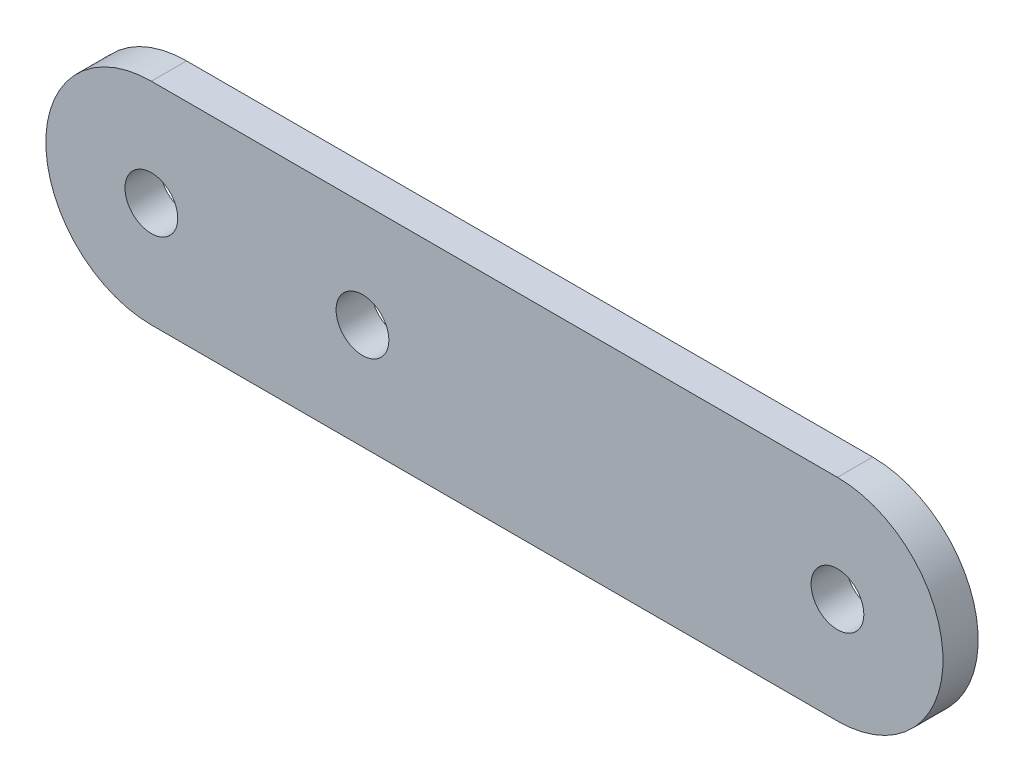
ISO-10303-21;
HEADER;
FILE_DESCRIPTION(('STEP AP214'),'2;1');
FILE_NAME('part.step','',(''),(''),'','','');
FILE_SCHEMA(('AUTOMOTIVE_DESIGN { 1 0 10303 214 1 1 1 1 }'));
ENDSEC;
DATA;
#1=APPLICATION_CONTEXT('core data for automotive mechanical design processes');
#2=APPLICATION_PROTOCOL_DEFINITION('international standard','automotive_design',2000,#1);
#3=PRODUCT_CONTEXT('',#1,'mechanical');
#4=PRODUCT('Part','Part','',(#3));
#5=PRODUCT_RELATED_PRODUCT_CATEGORY('part','',(#4));
#6=PRODUCT_DEFINITION_FORMATION('','',#4);
#7=PRODUCT_DEFINITION_CONTEXT('part definition',#1,'design');
#8=PRODUCT_DEFINITION('design','',#6,#7);
#9=PRODUCT_DEFINITION_SHAPE('','',#8);
#10=(LENGTH_UNIT() NAMED_UNIT(*) SI_UNIT(.MILLI.,.METRE.));
#11=(NAMED_UNIT(*) PLANE_ANGLE_UNIT() SI_UNIT($,.RADIAN.));
#12=(NAMED_UNIT(*) SI_UNIT($,.STERADIAN.) SOLID_ANGLE_UNIT());
#13=UNCERTAINTY_MEASURE_WITH_UNIT(LENGTH_MEASURE(1.E-05),#10,'distance_accuracy_value','');
#14=(GEOMETRIC_REPRESENTATION_CONTEXT(3) GLOBAL_UNCERTAINTY_ASSIGNED_CONTEXT((#13)) GLOBAL_UNIT_ASSIGNED_CONTEXT((#10,
#11,#12)) REPRESENTATION_CONTEXT('',''));
#15=CARTESIAN_POINT('',(0.,0.,0.));
#16=DIRECTION('',(0.,0.,1.));
#17=DIRECTION('',(1.,0.,0.));
#18=AXIS2_PLACEMENT_3D('',#15,#16,#17);
#19=CARTESIAN_POINT('',(0.,0.,2.));
#20=DIRECTION('',(0.,0.,-1.));
#21=DIRECTION('',(-1.,0.,0.));
#22=AXIS2_PLACEMENT_3D('',#19,#20,#21);
#23=PLANE('',#22);
#24=CARTESIAN_POINT('',(0.,0.,2.));
#25=DIRECTION('',(0.,0.,1.));
#26=DIRECTION('',(-1.,0.,0.));
#27=AXIS2_PLACEMENT_3D('',#24,#25,#26);
#28=CIRCLE('',#27,6.);
#29=CARTESIAN_POINT('',(0.,6.,2.));
#30=VERTEX_POINT('',#29);
#31=CARTESIAN_POINT('',(0.,-6.,2.));
#32=VERTEX_POINT('',#31);
#33=EDGE_CURVE('E85',#30,#32,#28,.T.);
#34=ORIENTED_EDGE('',*,*,#33,.T.);
#35=DIRECTION('',(1.,0.,0.));
#36=VECTOR('',#35,1.);
#37=CARTESIAN_POINT('',(39.,-6.,2.));
#38=LINE('',#37,#36);
#39=CARTESIAN_POINT('',(39.,-6.,2.));
#40=VERTEX_POINT('',#39);
#41=EDGE_CURVE('E80',#32,#40,#38,.T.);
#42=ORIENTED_EDGE('',*,*,#41,.T.);
#43=CARTESIAN_POINT('',(39.,0.,2.));
#44=DIRECTION('',(0.,0.,1.));
#45=DIRECTION('',(-1.,0.,0.));
#46=AXIS2_PLACEMENT_3D('',#43,#44,#45);
#47=CIRCLE('',#46,6.);
#48=CARTESIAN_POINT('',(39.,6.,2.));
#49=VERTEX_POINT('',#48);
#50=EDGE_CURVE('E83',#40,#49,#47,.T.);
#51=ORIENTED_EDGE('',*,*,#50,.T.);
#52=DIRECTION('',(-1.,0.,0.));
#53=VECTOR('',#52,1.);
#54=CARTESIAN_POINT('',(0.,6.,2.));
#55=LINE('',#54,#53);
#56=EDGE_CURVE('E50',#49,#30,#55,.T.);
#57=ORIENTED_EDGE('',*,*,#56,.T.);
#58=EDGE_LOOP('',(#34,#42,#51,#57));
#59=FACE_BOUND('',#58,.T.);
#60=CARTESIAN_POINT('',(0.,0.,2.));
#61=DIRECTION('',(0.,0.,1.));
#62=DIRECTION('',(1.,0.,0.));
#63=AXIS2_PLACEMENT_3D('',#60,#61,#62);
#64=CIRCLE('',#63,1.5);
#65=CARTESIAN_POINT('',(1.5,0.,2.));
#66=VERTEX_POINT('',#65);
#67=EDGE_CURVE('E100',#66,#66,#64,.T.);
#68=ORIENTED_EDGE('',*,*,#67,.F.);
#69=EDGE_LOOP('',(#68));
#70=FACE_BOUND('',#69,.T.);
#71=CARTESIAN_POINT('',(39.,0.,2.));
#72=DIRECTION('',(0.,0.,1.));
#73=DIRECTION('',(1.,0.,0.));
#74=AXIS2_PLACEMENT_3D('',#71,#72,#73);
#75=CIRCLE('',#74,1.5);
#76=CARTESIAN_POINT('',(40.5,0.,2.));
#77=VERTEX_POINT('',#76);
#78=EDGE_CURVE('E115',#77,#77,#75,.T.);
#79=ORIENTED_EDGE('',*,*,#78,.F.);
#80=EDGE_LOOP('',(#79));
#81=FACE_BOUND('',#80,.T.);
#82=CARTESIAN_POINT('',(12.,0.,2.));
#83=DIRECTION('',(0.,0.,1.));
#84=DIRECTION('',(1.,0.,0.));
#85=AXIS2_PLACEMENT_3D('',#82,#83,#84);
#86=CIRCLE('',#85,1.5);
#87=CARTESIAN_POINT('',(13.5,0.,2.));
#88=VERTEX_POINT('',#87);
#89=EDGE_CURVE('E121',#88,#88,#86,.T.);
#90=ORIENTED_EDGE('',*,*,#89,.F.);
#91=EDGE_LOOP('',(#90));
#92=FACE_BOUND('',#91,.T.);
#93=ADVANCED_FACE('F33',(#59,#70,#81,#92),#23,.F.);
#94=CARTESIAN_POINT('',(0.,0.,0.));
#95=DIRECTION('',(0.,0.,-1.));
#96=DIRECTION('',(-1.,0.,0.));
#97=AXIS2_PLACEMENT_3D('',#94,#95,#96);
#98=PLANE('',#97);
#99=CARTESIAN_POINT('',(39.,0.,0.));
#100=DIRECTION('',(0.,0.,1.));
#101=DIRECTION('',(1.,0.,0.));
#102=AXIS2_PLACEMENT_3D('',#99,#100,#101);
#103=CIRCLE('',#102,1.5);
#104=CARTESIAN_POINT('',(40.5,0.,0.));
#105=VERTEX_POINT('',#104);
#106=EDGE_CURVE('E118',#105,#105,#103,.T.);
#107=ORIENTED_EDGE('',*,*,#106,.T.);
#108=EDGE_LOOP('',(#107));
#109=FACE_BOUND('',#108,.T.);
#110=CARTESIAN_POINT('',(0.,0.,0.));
#111=DIRECTION('',(0.,0.,1.));
#112=DIRECTION('',(-1.,0.,0.));
#113=AXIS2_PLACEMENT_3D('',#110,#111,#112);
#114=CIRCLE('',#113,6.);
#115=CARTESIAN_POINT('',(0.,6.,0.));
#116=VERTEX_POINT('',#115);
#117=CARTESIAN_POINT('',(0.,-6.,0.));
#118=VERTEX_POINT('',#117);
#119=EDGE_CURVE('E97',#116,#118,#114,.T.);
#120=ORIENTED_EDGE('',*,*,#119,.F.);
#121=DIRECTION('',(-1.,0.,0.));
#122=VECTOR('',#121,1.);
#123=CARTESIAN_POINT('',(0.,6.,0.));
#124=LINE('',#123,#122);
#125=CARTESIAN_POINT('',(39.,6.,0.));
#126=VERTEX_POINT('',#125);
#127=EDGE_CURVE('E73',#126,#116,#124,.T.);
#128=ORIENTED_EDGE('',*,*,#127,.F.);
#129=CARTESIAN_POINT('',(39.,0.,0.));
#130=DIRECTION('',(0.,0.,1.));
#131=DIRECTION('',(-1.,0.,0.));
#132=AXIS2_PLACEMENT_3D('',#129,#130,#131);
#133=CIRCLE('',#132,6.);
#134=CARTESIAN_POINT('',(39.,-6.,0.));
#135=VERTEX_POINT('',#134);
#136=EDGE_CURVE('E67',#135,#126,#133,.T.);
#137=ORIENTED_EDGE('',*,*,#136,.F.);
#138=DIRECTION('',(1.,0.,0.));
#139=VECTOR('',#138,1.);
#140=CARTESIAN_POINT('',(39.,-6.,0.));
#141=LINE('',#140,#139);
#142=EDGE_CURVE('E89',#118,#135,#141,.T.);
#143=ORIENTED_EDGE('',*,*,#142,.F.);
#144=EDGE_LOOP('',(#120,#128,#137,#143));
#145=FACE_BOUND('',#144,.T.);
#146=CARTESIAN_POINT('',(0.,0.,0.));
#147=DIRECTION('',(0.,0.,1.));
#148=DIRECTION('',(1.,0.,0.));
#149=AXIS2_PLACEMENT_3D('',#146,#147,#148);
#150=CIRCLE('',#149,1.5);
#151=CARTESIAN_POINT('',(1.5,0.,0.));
#152=VERTEX_POINT('',#151);
#153=EDGE_CURVE('E112',#152,#152,#150,.T.);
#154=ORIENTED_EDGE('',*,*,#153,.T.);
#155=EDGE_LOOP('',(#154));
#156=FACE_BOUND('',#155,.T.);
#157=CARTESIAN_POINT('',(12.,0.,0.));
#158=DIRECTION('',(0.,0.,1.));
#159=DIRECTION('',(1.,0.,0.));
#160=AXIS2_PLACEMENT_3D('',#157,#158,#159);
#161=CIRCLE('',#160,1.5);
#162=CARTESIAN_POINT('',(13.5,0.,0.));
#163=VERTEX_POINT('',#162);
#164=EDGE_CURVE('E124',#163,#163,#161,.T.);
#165=ORIENTED_EDGE('',*,*,#164,.T.);
#166=EDGE_LOOP('',(#165));
#167=FACE_BOUND('',#166,.T.);
#168=ADVANCED_FACE('F108',(#109,#145,#156,#167),#98,.T.);
#169=CARTESIAN_POINT('',(0.,0.,2.));
#170=DIRECTION('',(0.,0.,-1.));
#171=DIRECTION('',(-1.,0.,0.));
#172=AXIS2_PLACEMENT_3D('',#169,#170,#171);
#173=CYLINDRICAL_SURFACE('',#172,6.);
#174=ORIENTED_EDGE('',*,*,#119,.T.);
#175=DIRECTION('',(0.,0.,-1.));
#176=VECTOR('',#175,1.);
#177=CARTESIAN_POINT('',(0.,-6.,2.));
#178=LINE('',#177,#176);
#179=EDGE_CURVE('E11',#32,#118,#178,.T.);
#180=ORIENTED_EDGE('',*,*,#179,.F.);
#181=ORIENTED_EDGE('',*,*,#33,.F.);
#182=DIRECTION('',(0.,0.,-1.));
#183=VECTOR('',#182,1.);
#184=CARTESIAN_POINT('',(0.,6.,2.));
#185=LINE('',#184,#183);
#186=EDGE_CURVE('E93',#30,#116,#185,.T.);
#187=ORIENTED_EDGE('',*,*,#186,.T.);
#188=EDGE_LOOP('',(#174,#180,#181,#187));
#189=FACE_BOUND('',#188,.T.);
#190=ADVANCED_FACE('F35',(#189),#173,.T.);
#191=CARTESIAN_POINT('',(39.,-6.,2.));
#192=DIRECTION('',(0.,1.,0.));
#193=DIRECTION('',(0.,0.,1.));
#194=AXIS2_PLACEMENT_3D('',#191,#192,#193);
#195=PLANE('',#194);
#196=ORIENTED_EDGE('',*,*,#142,.T.);
#197=DIRECTION('',(0.,0.,-1.));
#198=VECTOR('',#197,1.);
#199=CARTESIAN_POINT('',(39.,-6.,2.));
#200=LINE('',#199,#198);
#201=EDGE_CURVE('E42',#40,#135,#200,.T.);
#202=ORIENTED_EDGE('',*,*,#201,.F.);
#203=ORIENTED_EDGE('',*,*,#41,.F.);
#204=ORIENTED_EDGE('',*,*,#179,.T.);
#205=EDGE_LOOP('',(#196,#202,#203,#204));
#206=FACE_BOUND('',#205,.T.);
#207=ADVANCED_FACE('F88',(#206),#195,.F.);
#208=CARTESIAN_POINT('',(39.,0.,2.));
#209=DIRECTION('',(0.,0.,-1.));
#210=DIRECTION('',(-1.,0.,0.));
#211=AXIS2_PLACEMENT_3D('',#208,#209,#210);
#212=CYLINDRICAL_SURFACE('',#211,6.);
#213=ORIENTED_EDGE('',*,*,#136,.T.);
#214=DIRECTION('',(0.,0.,-1.));
#215=VECTOR('',#214,1.);
#216=CARTESIAN_POINT('',(39.,6.,2.));
#217=LINE('',#216,#215);
#218=EDGE_CURVE('E90',#49,#126,#217,.T.);
#219=ORIENTED_EDGE('',*,*,#218,.F.);
#220=ORIENTED_EDGE('',*,*,#50,.F.);
#221=ORIENTED_EDGE('',*,*,#201,.T.);
#222=EDGE_LOOP('',(#213,#219,#220,#221));
#223=FACE_BOUND('',#222,.T.);
#224=ADVANCED_FACE('F91',(#223),#212,.T.);
#225=CARTESIAN_POINT('',(0.,6.,2.));
#226=DIRECTION('',(0.,-1.,0.));
#227=DIRECTION('',(1.,0.,0.));
#228=AXIS2_PLACEMENT_3D('',#225,#226,#227);
#229=PLANE('',#228);
#230=ORIENTED_EDGE('',*,*,#127,.T.);
#231=ORIENTED_EDGE('',*,*,#186,.F.);
#232=ORIENTED_EDGE('',*,*,#56,.F.);
#233=ORIENTED_EDGE('',*,*,#218,.T.);
#234=EDGE_LOOP('',(#230,#231,#232,#233));
#235=FACE_BOUND('',#234,.T.);
#236=ADVANCED_FACE('F105',(#235),#229,.F.);
#237=CARTESIAN_POINT('',(0.,0.,2.));
#238=DIRECTION('',(0.,0.,-1.));
#239=DIRECTION('',(-1.,0.,0.));
#240=AXIS2_PLACEMENT_3D('',#237,#238,#239);
#241=CYLINDRICAL_SURFACE('',#240,1.5);
#242=ORIENTED_EDGE('',*,*,#67,.T.);
#243=EDGE_LOOP('',(#242));
#244=FACE_BOUND('',#243,.T.);
#245=ORIENTED_EDGE('',*,*,#153,.F.);
#246=EDGE_LOOP('',(#245));
#247=FACE_BOUND('',#246,.T.);
#248=ADVANCED_FACE('F141',(#244,#247),#241,.F.);
#249=CARTESIAN_POINT('',(39.,0.,2.));
#250=DIRECTION('',(0.,0.,-1.));
#251=DIRECTION('',(-1.,0.,0.));
#252=AXIS2_PLACEMENT_3D('',#249,#250,#251);
#253=CYLINDRICAL_SURFACE('',#252,1.5);
#254=ORIENTED_EDGE('',*,*,#78,.T.);
#255=EDGE_LOOP('',(#254));
#256=FACE_BOUND('',#255,.T.);
#257=ORIENTED_EDGE('',*,*,#106,.F.);
#258=EDGE_LOOP('',(#257));
#259=FACE_BOUND('',#258,.T.);
#260=ADVANCED_FACE('F187',(#256,#259),#253,.F.);
#261=CARTESIAN_POINT('',(12.,0.,2.));
#262=DIRECTION('',(0.,0.,-1.));
#263=DIRECTION('',(-1.,0.,0.));
#264=AXIS2_PLACEMENT_3D('',#261,#262,#263);
#265=CYLINDRICAL_SURFACE('',#264,1.5);
#266=ORIENTED_EDGE('',*,*,#89,.T.);
#267=EDGE_LOOP('',(#266));
#268=FACE_BOUND('',#267,.T.);
#269=ORIENTED_EDGE('',*,*,#164,.F.);
#270=EDGE_LOOP('',(#269));
#271=FACE_BOUND('',#270,.T.);
#272=ADVANCED_FACE('F130',(#268,#271),#265,.F.);
#273=CLOSED_SHELL('',(#93,#168,#190,#207,#224,#236,#248,#260,#272));
#274=MANIFOLD_SOLID_BREP('B2',#273);
#275=ADVANCED_BREP_SHAPE_REPRESENTATION('',(#18,#274),#14);
#276=SHAPE_DEFINITION_REPRESENTATION(#9,#275);
ENDSEC;
END-ISO-10303-21;
